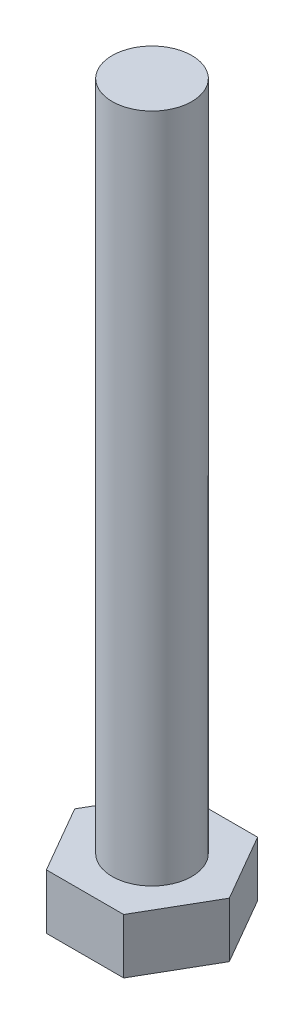
ISO-10303-21;
HEADER;
FILE_DESCRIPTION(('STEP AP214'),'2;1');
FILE_NAME('part.step','',(''),(''),'','','');
FILE_SCHEMA(('AUTOMOTIVE_DESIGN { 1 0 10303 214 1 1 1 1 }'));
ENDSEC;
DATA;
#1=APPLICATION_CONTEXT('core data for automotive mechanical design processes');
#2=APPLICATION_PROTOCOL_DEFINITION('international standard','automotive_design',2000,#1);
#3=PRODUCT_CONTEXT('',#1,'mechanical');
#4=PRODUCT('Part','Part','',(#3));
#5=PRODUCT_RELATED_PRODUCT_CATEGORY('part','',(#4));
#6=PRODUCT_DEFINITION_FORMATION('','',#4);
#7=PRODUCT_DEFINITION_CONTEXT('part definition',#1,'design');
#8=PRODUCT_DEFINITION('design','',#6,#7);
#9=PRODUCT_DEFINITION_SHAPE('','',#8);
#10=(LENGTH_UNIT() NAMED_UNIT(*) SI_UNIT(.MILLI.,.METRE.));
#11=(NAMED_UNIT(*) PLANE_ANGLE_UNIT() SI_UNIT($,.RADIAN.));
#12=(NAMED_UNIT(*) SI_UNIT($,.STERADIAN.) SOLID_ANGLE_UNIT());
#13=UNCERTAINTY_MEASURE_WITH_UNIT(LENGTH_MEASURE(1.E-05),#10,'distance_accuracy_value','');
#14=(GEOMETRIC_REPRESENTATION_CONTEXT(3) GLOBAL_UNCERTAINTY_ASSIGNED_CONTEXT((#13)) GLOBAL_UNIT_ASSIGNED_CONTEXT((#10,
#11,#12)) REPRESENTATION_CONTEXT('',''));
#15=CARTESIAN_POINT('',(0.,0.,0.));
#16=DIRECTION('',(0.,0.,1.));
#17=DIRECTION('',(1.,0.,0.));
#18=AXIS2_PLACEMENT_3D('',#15,#16,#17);
#19=CARTESIAN_POINT('',(0.,6.9,0.));
#20=DIRECTION('',(0.,1.,0.));
#21=DIRECTION('',(0.,0.,1.));
#22=AXIS2_PLACEMENT_3D('',#19,#20,#21);
#23=PLANE('',#22);
#24=DIRECTION('',(1.,0.,0.));
#25=VECTOR('',#24,1.);
#26=CARTESIAN_POINT('',(-4.84974226119286,6.9,8.4));
#27=LINE('',#26,#25);
#28=CARTESIAN_POINT('',(-4.84974226119286,6.9,8.4));
#29=VERTEX_POINT('',#28);
#30=CARTESIAN_POINT('',(4.84974226119285,6.9,8.4));
#31=VERTEX_POINT('',#30);
#32=EDGE_CURVE('E152',#29,#31,#27,.T.);
#33=ORIENTED_EDGE('',*,*,#32,.T.);
#34=DIRECTION('',(0.5,0.,-0.866025403784439));
#35=VECTOR('',#34,1.);
#36=CARTESIAN_POINT('',(4.84974226119285,6.9,8.4));
#37=LINE('',#36,#35);
#38=CARTESIAN_POINT('',(9.69948452238571,6.9,0.));
#39=VERTEX_POINT('',#38);
#40=EDGE_CURVE('E100',#31,#39,#37,.T.);
#41=ORIENTED_EDGE('',*,*,#40,.T.);
#42=DIRECTION('',(-0.5,0.,-0.866025403784439));
#43=VECTOR('',#42,1.);
#44=CARTESIAN_POINT('',(9.69948452238571,6.9,0.));
#45=LINE('',#44,#43);
#46=CARTESIAN_POINT('',(4.84974226119285,6.9,-8.4));
#47=VERTEX_POINT('',#46);
#48=EDGE_CURVE('E113',#39,#47,#45,.T.);
#49=ORIENTED_EDGE('',*,*,#48,.T.);
#50=DIRECTION('',(-1.,0.,0.));
#51=VECTOR('',#50,1.);
#52=CARTESIAN_POINT('',(4.84974226119285,6.9,-8.4));
#53=LINE('',#52,#51);
#54=CARTESIAN_POINT('',(-4.84974226119286,6.9,-8.4));
#55=VERTEX_POINT('',#54);
#56=EDGE_CURVE('E107',#47,#55,#53,.T.);
#57=ORIENTED_EDGE('',*,*,#56,.T.);
#58=DIRECTION('',(-0.5,0.,0.866025403784439));
#59=VECTOR('',#58,1.);
#60=CARTESIAN_POINT('',(-4.84974226119286,6.9,-8.4));
#61=LINE('',#60,#59);
#62=CARTESIAN_POINT('',(-9.69948452238571,6.9,0.));
#63=VERTEX_POINT('',#62);
#64=EDGE_CURVE('E111',#55,#63,#61,.T.);
#65=ORIENTED_EDGE('',*,*,#64,.T.);
#66=DIRECTION('',(0.5,0.,0.866025403784439));
#67=VECTOR('',#66,1.);
#68=CARTESIAN_POINT('',(-9.69948452238571,6.9,0.));
#69=LINE('',#68,#67);
#70=EDGE_CURVE('E63',#63,#29,#69,.T.);
#71=ORIENTED_EDGE('',*,*,#70,.T.);
#72=EDGE_LOOP('',(#33,#41,#49,#57,#65,#71));
#73=FACE_BOUND('',#72,.T.);
#74=CARTESIAN_POINT('',(0.,6.9,0.));
#75=DIRECTION('',(0.,1.,0.));
#76=DIRECTION('',(0.,0.,1.));
#77=AXIS2_PLACEMENT_3D('',#74,#75,#76);
#78=CIRCLE('',#77,5.);
#79=CARTESIAN_POINT('',(0.,6.89999999999999,-5.));
#80=VERTEX_POINT('',#79);
#81=EDGE_CURVE('E140',#80,#80,#78,.T.);
#82=ORIENTED_EDGE('',*,*,#81,.F.);
#83=EDGE_LOOP('',(#82));
#84=FACE_BOUND('',#83,.T.);
#85=ADVANCED_FACE('F45',(#73,#84),#23,.T.);
#86=CARTESIAN_POINT('',(0.,0.,0.));
#87=DIRECTION('',(0.,1.,0.));
#88=DIRECTION('',(0.,0.,1.));
#89=AXIS2_PLACEMENT_3D('',#86,#87,#88);
#90=PLANE('',#89);
#91=DIRECTION('',(1.,0.,0.));
#92=VECTOR('',#91,1.);
#93=CARTESIAN_POINT('',(-4.84974226119286,0.,8.4));
#94=LINE('',#93,#92);
#95=CARTESIAN_POINT('',(-4.84974226119286,0.,8.4));
#96=VERTEX_POINT('',#95);
#97=CARTESIAN_POINT('',(4.84974226119285,0.,8.4));
#98=VERTEX_POINT('',#97);
#99=EDGE_CURVE('E135',#96,#98,#94,.T.);
#100=ORIENTED_EDGE('',*,*,#99,.F.);
#101=DIRECTION('',(0.5,0.,0.866025403784439));
#102=VECTOR('',#101,1.);
#103=CARTESIAN_POINT('',(-9.69948452238571,0.,0.));
#104=LINE('',#103,#102);
#105=CARTESIAN_POINT('',(-9.69948452238571,0.,0.));
#106=VERTEX_POINT('',#105);
#107=EDGE_CURVE('E92',#106,#96,#104,.T.);
#108=ORIENTED_EDGE('',*,*,#107,.F.);
#109=DIRECTION('',(-0.5,0.,0.866025403784439));
#110=VECTOR('',#109,1.);
#111=CARTESIAN_POINT('',(-4.84974226119286,0.,-8.4));
#112=LINE('',#111,#110);
#113=CARTESIAN_POINT('',(-4.84974226119286,0.,-8.4));
#114=VERTEX_POINT('',#113);
#115=EDGE_CURVE('E86',#114,#106,#112,.T.);
#116=ORIENTED_EDGE('',*,*,#115,.F.);
#117=DIRECTION('',(-1.,0.,0.));
#118=VECTOR('',#117,1.);
#119=CARTESIAN_POINT('',(4.84974226119285,0.,-8.4));
#120=LINE('',#119,#118);
#121=CARTESIAN_POINT('',(4.84974226119285,0.,-8.4));
#122=VERTEX_POINT('',#121);
#123=EDGE_CURVE('E122',#122,#114,#120,.T.);
#124=ORIENTED_EDGE('',*,*,#123,.F.);
#125=DIRECTION('',(-0.5,0.,-0.866025403784439));
#126=VECTOR('',#125,1.);
#127=CARTESIAN_POINT('',(9.69948452238571,0.,0.));
#128=LINE('',#127,#126);
#129=CARTESIAN_POINT('',(9.69948452238571,0.,0.));
#130=VERTEX_POINT('',#129);
#131=EDGE_CURVE('E143',#130,#122,#128,.T.);
#132=ORIENTED_EDGE('',*,*,#131,.F.);
#133=DIRECTION('',(0.5,0.,-0.866025403784439));
#134=VECTOR('',#133,1.);
#135=CARTESIAN_POINT('',(4.84974226119285,0.,8.4));
#136=LINE('',#135,#134);
#137=EDGE_CURVE('E139',#98,#130,#136,.T.);
#138=ORIENTED_EDGE('',*,*,#137,.F.);
#139=EDGE_LOOP('',(#100,#108,#116,#124,#132,#138));
#140=FACE_BOUND('',#139,.T.);
#141=ADVANCED_FACE('F165',(#140),#90,.F.);
#142=CARTESIAN_POINT('',(-4.84974226119286,6.9,8.4));
#143=DIRECTION('',(0.,0.,-1.));
#144=DIRECTION('',(-1.,0.,0.));
#145=AXIS2_PLACEMENT_3D('',#142,#143,#144);
#146=PLANE('',#145);
#147=ORIENTED_EDGE('',*,*,#99,.T.);
#148=DIRECTION('',(0.,-1.,0.));
#149=VECTOR('',#148,1.);
#150=CARTESIAN_POINT('',(4.84974226119285,6.9,8.4));
#151=LINE('',#150,#149);
#152=EDGE_CURVE('E11',#31,#98,#151,.T.);
#153=ORIENTED_EDGE('',*,*,#152,.F.);
#154=ORIENTED_EDGE('',*,*,#32,.F.);
#155=DIRECTION('',(0.,-1.,0.));
#156=VECTOR('',#155,1.);
#157=CARTESIAN_POINT('',(-4.84974226119286,6.9,8.4));
#158=LINE('',#157,#156);
#159=EDGE_CURVE('E131',#29,#96,#158,.T.);
#160=ORIENTED_EDGE('',*,*,#159,.T.);
#161=EDGE_LOOP('',(#147,#153,#154,#160));
#162=FACE_BOUND('',#161,.T.);
#163=ADVANCED_FACE('F47',(#162),#146,.F.);
#164=CARTESIAN_POINT('',(4.84974226119285,6.9,8.4));
#165=DIRECTION('',(-0.866025403784439,0.,-0.5));
#166=DIRECTION('',(-0.5,0.,0.866025403784439));
#167=AXIS2_PLACEMENT_3D('',#164,#165,#166);
#168=PLANE('',#167);
#169=ORIENTED_EDGE('',*,*,#137,.T.);
#170=DIRECTION('',(0.,-1.,0.));
#171=VECTOR('',#170,1.);
#172=CARTESIAN_POINT('',(9.69948452238571,6.9,0.));
#173=LINE('',#172,#171);
#174=EDGE_CURVE('E55',#39,#130,#173,.T.);
#175=ORIENTED_EDGE('',*,*,#174,.F.);
#176=ORIENTED_EDGE('',*,*,#40,.F.);
#177=ORIENTED_EDGE('',*,*,#152,.T.);
#178=EDGE_LOOP('',(#169,#175,#176,#177));
#179=FACE_BOUND('',#178,.T.);
#180=ADVANCED_FACE('F239',(#179),#168,.F.);
#181=CARTESIAN_POINT('',(9.69948452238571,6.9,0.));
#182=DIRECTION('',(-0.866025403784439,0.,0.5));
#183=DIRECTION('',(0.5,0.,0.866025403784439));
#184=AXIS2_PLACEMENT_3D('',#181,#182,#183);
#185=PLANE('',#184);
#186=ORIENTED_EDGE('',*,*,#131,.T.);
#187=DIRECTION('',(0.,-1.,0.));
#188=VECTOR('',#187,1.);
#189=CARTESIAN_POINT('',(4.84974226119285,6.9,-8.4));
#190=LINE('',#189,#188);
#191=EDGE_CURVE('E124',#47,#122,#190,.T.);
#192=ORIENTED_EDGE('',*,*,#191,.F.);
#193=ORIENTED_EDGE('',*,*,#48,.F.);
#194=ORIENTED_EDGE('',*,*,#174,.T.);
#195=EDGE_LOOP('',(#186,#192,#193,#194));
#196=FACE_BOUND('',#195,.T.);
#197=ADVANCED_FACE('F162',(#196),#185,.F.);
#198=CARTESIAN_POINT('',(4.84974226119285,6.9,-8.4));
#199=DIRECTION('',(0.,0.,1.));
#200=DIRECTION('',(1.,0.,0.));
#201=AXIS2_PLACEMENT_3D('',#198,#199,#200);
#202=PLANE('',#201);
#203=ORIENTED_EDGE('',*,*,#123,.T.);
#204=DIRECTION('',(0.,-1.,0.));
#205=VECTOR('',#204,1.);
#206=CARTESIAN_POINT('',(-4.84974226119286,6.9,-8.4));
#207=LINE('',#206,#205);
#208=EDGE_CURVE('E119',#55,#114,#207,.T.);
#209=ORIENTED_EDGE('',*,*,#208,.F.);
#210=ORIENTED_EDGE('',*,*,#56,.F.);
#211=ORIENTED_EDGE('',*,*,#191,.T.);
#212=EDGE_LOOP('',(#203,#209,#210,#211));
#213=FACE_BOUND('',#212,.T.);
#214=ADVANCED_FACE('F120',(#213),#202,.F.);
#215=CARTESIAN_POINT('',(-4.84974226119286,6.9,-8.4));
#216=DIRECTION('',(0.866025403784439,0.,0.5));
#217=DIRECTION('',(0.5,0.,-0.866025403784439));
#218=AXIS2_PLACEMENT_3D('',#215,#216,#217);
#219=PLANE('',#218);
#220=ORIENTED_EDGE('',*,*,#115,.T.);
#221=DIRECTION('',(0.,-1.,0.));
#222=VECTOR('',#221,1.);
#223=CARTESIAN_POINT('',(-9.69948452238571,6.9,0.));
#224=LINE('',#223,#222);
#225=EDGE_CURVE('E125',#63,#106,#224,.T.);
#226=ORIENTED_EDGE('',*,*,#225,.F.);
#227=ORIENTED_EDGE('',*,*,#64,.F.);
#228=ORIENTED_EDGE('',*,*,#208,.T.);
#229=EDGE_LOOP('',(#220,#226,#227,#228));
#230=FACE_BOUND('',#229,.T.);
#231=ADVANCED_FACE('F127',(#230),#219,.F.);
#232=CARTESIAN_POINT('',(-9.69948452238571,6.9,0.));
#233=DIRECTION('',(0.866025403784439,0.,-0.5));
#234=DIRECTION('',(-0.5,0.,-0.866025403784439));
#235=AXIS2_PLACEMENT_3D('',#232,#233,#234);
#236=PLANE('',#235);
#237=ORIENTED_EDGE('',*,*,#107,.T.);
#238=ORIENTED_EDGE('',*,*,#159,.F.);
#239=ORIENTED_EDGE('',*,*,#70,.F.);
#240=ORIENTED_EDGE('',*,*,#225,.T.);
#241=EDGE_LOOP('',(#237,#238,#239,#240));
#242=FACE_BOUND('',#241,.T.);
#243=ADVANCED_FACE('F169',(#242),#236,.F.);
#244=CARTESIAN_POINT('',(0.,91.1,0.));
#245=DIRECTION('',(0.,-1.,0.));
#246=DIRECTION('',(0.,0.,-1.));
#247=AXIS2_PLACEMENT_3D('',#244,#245,#246);
#248=CYLINDRICAL_SURFACE('',#247,5.);
#249=CARTESIAN_POINT('',(0.,91.1,0.));
#250=DIRECTION('',(0.,1.,0.));
#251=DIRECTION('',(0.,0.,1.));
#252=AXIS2_PLACEMENT_3D('',#249,#250,#251);
#253=CIRCLE('',#252,5.);
#254=CARTESIAN_POINT('',(0.,91.1,-5.));
#255=VERTEX_POINT('',#254);
#256=EDGE_CURVE('E194',#255,#255,#253,.T.);
#257=CARTESIAN_POINT('',(0.,6.89999999999999,-5.));
#258=CARTESIAN_POINT('',(0.,7.77708333333332,-5.));
#259=CARTESIAN_POINT('',(0.,8.65416666666666,-5.));
#260=CARTESIAN_POINT('',(0.,10.4083333333333,-5.));
#261=CARTESIAN_POINT('',(0.,11.2854166666667,-5.));
#262=CARTESIAN_POINT('',(0.,13.0395833333333,-5.));
#263=CARTESIAN_POINT('',(0.,13.9166666666667,-5.));
#264=CARTESIAN_POINT('',(0.,15.6708333333333,-5.));
#265=CARTESIAN_POINT('',(0.,16.5479166666667,-5.));
#266=CARTESIAN_POINT('',(0.,18.3020833333333,-5.));
#267=CARTESIAN_POINT('',(0.,19.1791666666667,-5.));
#268=CARTESIAN_POINT('',(0.,20.9333333333333,-5.));
#269=CARTESIAN_POINT('',(0.,21.8104166666667,-5.));
#270=CARTESIAN_POINT('',(0.,23.5645833333333,-5.));
#271=CARTESIAN_POINT('',(0.,24.4416666666667,-5.));
#272=CARTESIAN_POINT('',(0.,26.1958333333333,-5.));
#273=CARTESIAN_POINT('',(0.,27.0729166666667,-5.));
#274=CARTESIAN_POINT('',(0.,28.8270833333333,-5.));
#275=CARTESIAN_POINT('',(0.,29.7041666666667,-5.));
#276=CARTESIAN_POINT('',(0.,31.4583333333333,-5.));
#277=CARTESIAN_POINT('',(0.,32.3354166666667,-5.));
#278=CARTESIAN_POINT('',(0.,34.0895833333333,-5.));
#279=CARTESIAN_POINT('',(0.,34.9666666666667,-5.));
#280=CARTESIAN_POINT('',(0.,36.7208333333333,-5.));
#281=CARTESIAN_POINT('',(0.,37.5979166666667,-5.));
#282=CARTESIAN_POINT('',(0.,39.3520833333333,-5.));
#283=CARTESIAN_POINT('',(0.,40.2291666666667,-5.));
#284=CARTESIAN_POINT('',(0.,41.9833333333333,-5.));
#285=CARTESIAN_POINT('',(0.,42.8604166666667,-5.));
#286=CARTESIAN_POINT('',(0.,44.6145833333333,-5.));
#287=CARTESIAN_POINT('',(0.,45.4916666666667,-5.));
#288=CARTESIAN_POINT('',(0.,47.2458333333333,-5.));
#289=CARTESIAN_POINT('',(0.,48.1229166666667,-5.));
#290=CARTESIAN_POINT('',(0.,49.8770833333333,-5.));
#291=CARTESIAN_POINT('',(0.,50.7541666666667,-5.));
#292=CARTESIAN_POINT('',(0.,52.5083333333333,-5.));
#293=CARTESIAN_POINT('',(0.,53.3854166666667,-5.));
#294=CARTESIAN_POINT('',(0.,55.1395833333333,-5.));
#295=CARTESIAN_POINT('',(0.,56.0166666666667,-5.));
#296=CARTESIAN_POINT('',(0.,57.7708333333333,-5.));
#297=CARTESIAN_POINT('',(0.,58.6479166666667,-5.));
#298=CARTESIAN_POINT('',(0.,60.4020833333333,-5.));
#299=CARTESIAN_POINT('',(0.,61.2791666666667,-5.));
#300=CARTESIAN_POINT('',(0.,63.0333333333333,-5.));
#301=CARTESIAN_POINT('',(0.,63.9104166666667,-5.));
#302=CARTESIAN_POINT('',(0.,65.6645833333333,-5.));
#303=CARTESIAN_POINT('',(0.,66.5416666666667,-5.));
#304=CARTESIAN_POINT('',(0.,68.2958333333333,-5.));
#305=CARTESIAN_POINT('',(0.,69.1729166666667,-5.));
#306=CARTESIAN_POINT('',(0.,70.9270833333333,-5.));
#307=CARTESIAN_POINT('',(0.,71.8041666666667,-5.));
#308=CARTESIAN_POINT('',(0.,73.5583333333333,-5.));
#309=CARTESIAN_POINT('',(0.,74.4354166666667,-5.));
#310=CARTESIAN_POINT('',(0.,76.1895833333333,-5.));
#311=CARTESIAN_POINT('',(0.,77.0666666666667,-5.));
#312=CARTESIAN_POINT('',(0.,78.8208333333333,-5.));
#313=CARTESIAN_POINT('',(0.,79.6979166666667,-5.));
#314=CARTESIAN_POINT('',(0.,81.4520833333333,-5.));
#315=CARTESIAN_POINT('',(0.,82.3291666666667,-5.));
#316=CARTESIAN_POINT('',(0.,84.0833333333333,-5.));
#317=CARTESIAN_POINT('',(0.,84.9604166666667,-5.));
#318=CARTESIAN_POINT('',(0.,86.7145833333333,-5.));
#319=CARTESIAN_POINT('',(0.,87.5916666666667,-5.));
#320=CARTESIAN_POINT('',(0.,89.3458333333333,-5.));
#321=CARTESIAN_POINT('',(0.,90.2229166666667,-5.));
#322=CARTESIAN_POINT('',(0.,91.1,-5.));
#323=B_SPLINE_CURVE_WITH_KNOTS('',3,(#257,#258,#259,#260,#261,#262,#263,#264,#265,#266,#267,
#268,#269,#270,#271,#272,#273,#274,#275,#276,#277,#278,#279,#280,#281,#282,#283,#284,#285,#286,
#287,#288,#289,#290,#291,#292,#293,#294,#295,#296,#297,#298,#299,#300,#301,#302,#303,#304,#305,
#306,#307,#308,#309,#310,#311,#312,#313,#314,#315,#316,#317,#318,#319,#320,#321,#322),
.UNSPECIFIED.,.F.,.F.,(4,2,2,2,2,2,2,2,2,2,2,2,2,2,2,2,2,2,2,2,2,2,2,2,2,2,2,2,2,2,2,2,4),(0.,
2.63125,5.2625,7.89375000000001,10.525,13.15625,15.7875,18.41875,21.05,23.68125,26.3125,
28.94375,31.575,34.20625,36.8375,39.46875,42.1,44.73125,47.3625,49.99375,52.625,55.25625,
57.8875,60.51875,63.15,65.78125,68.4125,71.04375,73.675,76.30625,78.9375,81.56875,84.2),.UNSPECIFIED.);
#324=EDGE_CURVE('BSEAM171',#80,#255,#323,.T.);
#325=ORIENTED_EDGE('',*,*,#81,.T.);
#326=ORIENTED_EDGE('',*,*,#256,.F.);
#327=ORIENTED_EDGE('',*,*,#324,.T.);
#328=ORIENTED_EDGE('',*,*,#324,.F.);
#329=EDGE_LOOP('',(#325,#327,#326,#328));
#330=FACE_BOUND('',#329,.T.);
#331=ADVANCED_FACE('F171',(#330),#248,.T.);
#332=CARTESIAN_POINT('',(0.,91.1,0.));
#333=DIRECTION('',(0.,1.,0.));
#334=DIRECTION('',(0.,0.,1.));
#335=AXIS2_PLACEMENT_3D('',#332,#333,#334);
#336=PLANE('',#335);
#337=ORIENTED_EDGE('',*,*,#256,.T.);
#338=EDGE_LOOP('',(#337));
#339=FACE_BOUND('',#338,.T.);
#340=ADVANCED_FACE('F177',(#339),#336,.T.);
#341=CLOSED_SHELL('',(#85,#141,#163,#180,#197,#214,#231,#243,#331,#340));
#342=MANIFOLD_SOLID_BREP('B2',#341);
#343=ADVANCED_BREP_SHAPE_REPRESENTATION('',(#18,#342),#14);
#344=SHAPE_DEFINITION_REPRESENTATION(#9,#343);
ENDSEC;
END-ISO-10303-21;
